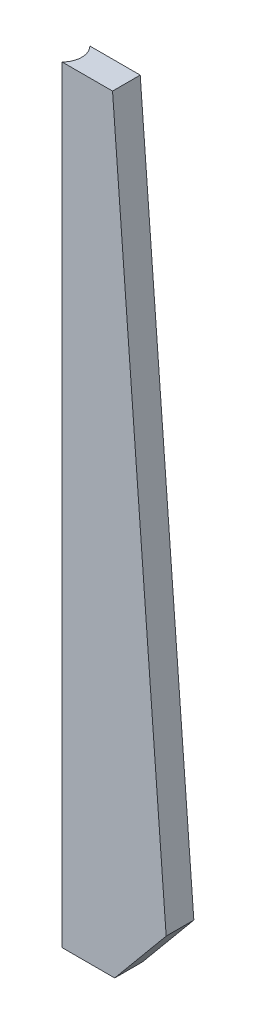
ISO-10303-21;
HEADER;
FILE_DESCRIPTION(('STEP AP214'),'2;1');
FILE_NAME('part.step','',(''),(''),'','','');
FILE_SCHEMA(('AUTOMOTIVE_DESIGN { 1 0 10303 214 1 1 1 1 }'));
ENDSEC;
DATA;
#1=APPLICATION_CONTEXT('core data for automotive mechanical design processes');
#2=APPLICATION_PROTOCOL_DEFINITION('international standard','automotive_design',2000,#1);
#3=PRODUCT_CONTEXT('',#1,'mechanical');
#4=PRODUCT('Part','Part','',(#3));
#5=PRODUCT_RELATED_PRODUCT_CATEGORY('part','',(#4));
#6=PRODUCT_DEFINITION_FORMATION('','',#4);
#7=PRODUCT_DEFINITION_CONTEXT('part definition',#1,'design');
#8=PRODUCT_DEFINITION('design','',#6,#7);
#9=PRODUCT_DEFINITION_SHAPE('','',#8);
#10=(LENGTH_UNIT() NAMED_UNIT(*) SI_UNIT(.MILLI.,.METRE.));
#11=(NAMED_UNIT(*) PLANE_ANGLE_UNIT() SI_UNIT($,.RADIAN.));
#12=(NAMED_UNIT(*) SI_UNIT($,.STERADIAN.) SOLID_ANGLE_UNIT());
#13=UNCERTAINTY_MEASURE_WITH_UNIT(LENGTH_MEASURE(1.E-05),#10,'distance_accuracy_value','');
#14=(GEOMETRIC_REPRESENTATION_CONTEXT(3) GLOBAL_UNCERTAINTY_ASSIGNED_CONTEXT((#13)) GLOBAL_UNIT_ASSIGNED_CONTEXT((#10,
#11,#12)) REPRESENTATION_CONTEXT('',''));
#15=CARTESIAN_POINT('',(0.,0.,0.));
#16=DIRECTION('',(0.,0.,1.));
#17=DIRECTION('',(1.,0.,0.));
#18=AXIS2_PLACEMENT_3D('',#15,#16,#17);
#19=CARTESIAN_POINT('',(388.602137482405,96.4501054043385,12.));
#20=DIRECTION('',(-0.76948574410608,0.638663988038713,0.));
#21=DIRECTION('',(-0.638663988038713,-0.76948574410608,0.));
#22=AXIS2_PLACEMENT_3D('',#19,#20,#21);
#23=PLANE('',#22);
#24=DIRECTION('',(0.638663988038713,0.76948574410608,0.));
#25=VECTOR('',#24,1.);
#26=CARTESIAN_POINT('',(388.602137482405,96.4501054043385,3.));
#27=LINE('',#26,#25);
#28=CARTESIAN_POINT('',(371.863564261326,76.2828598550013,3.));
#29=VERTEX_POINT('',#28);
#30=CARTESIAN_POINT('',(388.602137482405,96.4501054043385,3.));
#31=VERTEX_POINT('',#30);
#32=EDGE_CURVE('E110',#29,#31,#27,.T.);
#33=ORIENTED_EDGE('',*,*,#32,.T.);
#34=DIRECTION('',(0.,0.,-1.));
#35=VECTOR('',#34,1.);
#36=CARTESIAN_POINT('',(388.602137482405,96.4501054043385,12.));
#37=LINE('',#36,#35);
#38=CARTESIAN_POINT('',(388.602137482405,96.4501054043385,12.));
#39=VERTEX_POINT('',#38);
#40=EDGE_CURVE('E11',#39,#31,#37,.T.);
#41=ORIENTED_EDGE('',*,*,#40,.F.);
#42=DIRECTION('',(0.638663988038713,0.76948574410608,0.));
#43=VECTOR('',#42,1.);
#44=CARTESIAN_POINT('',(388.602137482405,96.4501054043385,12.));
#45=LINE('',#44,#43);
#46=CARTESIAN_POINT('',(371.863564261326,76.2828598550013,12.));
#47=VERTEX_POINT('',#46);
#48=EDGE_CURVE('E104',#47,#39,#45,.T.);
#49=ORIENTED_EDGE('',*,*,#48,.F.);
#50=DIRECTION('',(0.,0.,-1.));
#51=VECTOR('',#50,1.);
#52=CARTESIAN_POINT('',(371.863564261326,76.2828598550013,12.));
#53=LINE('',#52,#51);
#54=EDGE_CURVE('E109',#47,#29,#53,.T.);
#55=ORIENTED_EDGE('',*,*,#54,.T.);
#56=EDGE_LOOP('',(#33,#41,#49,#55));
#57=FACE_BOUND('',#56,.T.);
#58=ADVANCED_FACE('F35',(#57),#23,.F.);
#59=CARTESIAN_POINT('',(371.164187359032,325.684859855001,12.));
#60=DIRECTION('',(-0.997119153762004,-0.0758511252450758,0.));
#61=DIRECTION('',(0.0758511252450758,-0.997119153762004,0.));
#62=AXIS2_PLACEMENT_3D('',#59,#60,#61);
#63=PLANE('',#62);
#64=DIRECTION('',(-0.0758511252450758,0.997119153762004,0.));
#65=VECTOR('',#64,1.);
#66=CARTESIAN_POINT('',(371.164187359032,325.684859855001,3.));
#67=LINE('',#66,#65);
#68=CARTESIAN_POINT('',(371.164187359032,325.684859855001,3.));
#69=VERTEX_POINT('',#68);
#70=EDGE_CURVE('E113',#31,#69,#67,.T.);
#71=ORIENTED_EDGE('',*,*,#70,.T.);
#72=DIRECTION('',(0.,0.,-1.));
#73=VECTOR('',#72,1.);
#74=CARTESIAN_POINT('',(371.164187359032,325.684859855001,12.));
#75=LINE('',#74,#73);
#76=CARTESIAN_POINT('',(371.164187359032,325.684859855001,12.));
#77=VERTEX_POINT('',#76);
#78=EDGE_CURVE('E43',#77,#69,#75,.T.);
#79=ORIENTED_EDGE('',*,*,#78,.F.);
#80=DIRECTION('',(-0.0758511252450758,0.997119153762004,0.));
#81=VECTOR('',#80,1.);
#82=CARTESIAN_POINT('',(371.164187359032,325.684859855001,12.));
#83=LINE('',#82,#81);
#84=EDGE_CURVE('E81',#39,#77,#83,.T.);
#85=ORIENTED_EDGE('',*,*,#84,.F.);
#86=ORIENTED_EDGE('',*,*,#40,.T.);
#87=EDGE_LOOP('',(#71,#79,#85,#86));
#88=FACE_BOUND('',#87,.T.);
#89=ADVANCED_FACE('F127',(#88),#63,.F.);
#90=CARTESIAN_POINT('',(354.784682652771,325.684859855001,12.));
#91=DIRECTION('',(0.,-1.,0.));
#92=DIRECTION('',(0.,0.,-1.));
#93=AXIS2_PLACEMENT_3D('',#90,#91,#92);
#94=PLANE('',#93);
#95=DIRECTION('',(-1.,0.,0.));
#96=VECTOR('',#95,1.);
#97=CARTESIAN_POINT('',(354.784682652771,325.684859855001,3.));
#98=LINE('',#97,#96);
#99=CARTESIAN_POINT('',(354.784682652771,325.684859855001,3.));
#100=VERTEX_POINT('',#99);
#101=EDGE_CURVE('E99',#69,#100,#98,.T.);
#102=ORIENTED_EDGE('',*,*,#101,.T.);
#103=CARTESIAN_POINT('',(350.284682652771,325.684859855001,7.5));
#104=DIRECTION('',(0.,1.,0.));
#105=DIRECTION('',(0.,0.,1.));
#106=AXIS2_PLACEMENT_3D('',#103,#104,#105);
#107=CIRCLE('',#106,6.36396103067893);
#108=CARTESIAN_POINT('',(354.784682652771,325.684859855001,12.));
#109=VERTEX_POINT('',#108);
#110=EDGE_CURVE('E70',#109,#100,#107,.T.);
#111=ORIENTED_EDGE('',*,*,#110,.F.);
#112=DIRECTION('',(-1.,0.,0.));
#113=VECTOR('',#112,1.);
#114=CARTESIAN_POINT('',(354.784682652771,325.684859855001,12.));
#115=LINE('',#114,#113);
#116=EDGE_CURVE('E92',#77,#109,#115,.T.);
#117=ORIENTED_EDGE('',*,*,#116,.F.);
#118=ORIENTED_EDGE('',*,*,#78,.T.);
#119=EDGE_LOOP('',(#102,#111,#117,#118));
#120=FACE_BOUND('',#119,.T.);
#121=ADVANCED_FACE('F96',(#120),#94,.F.);
#122=CARTESIAN_POINT('',(354.784682652771,76.2828598550013,12.));
#123=DIRECTION('',(0.,1.,0.));
#124=DIRECTION('',(0.,0.,1.));
#125=AXIS2_PLACEMENT_3D('',#122,#123,#124);
#126=PLANE('',#125);
#127=DIRECTION('',(1.,0.,0.));
#128=VECTOR('',#127,1.);
#129=CARTESIAN_POINT('',(354.784682652771,76.2828598550013,12.));
#130=LINE('',#129,#128);
#131=CARTESIAN_POINT('',(354.784682652771,76.2828598550013,12.));
#132=VERTEX_POINT('',#131);
#133=EDGE_CURVE('E51',#132,#47,#130,.T.);
#134=ORIENTED_EDGE('',*,*,#133,.F.);
#135=CARTESIAN_POINT('',(350.284682652771,76.2828598550013,7.5));
#136=DIRECTION('',(0.,1.,0.));
#137=DIRECTION('',(0.,0.,1.));
#138=AXIS2_PLACEMENT_3D('',#135,#136,#137);
#139=CIRCLE('',#138,6.36396103067893);
#140=CARTESIAN_POINT('',(354.784682652771,76.2828598550013,3.));
#141=VERTEX_POINT('',#140);
#142=EDGE_CURVE('E90',#132,#141,#139,.T.);
#143=ORIENTED_EDGE('',*,*,#142,.T.);
#144=DIRECTION('',(1.,0.,0.));
#145=VECTOR('',#144,1.);
#146=CARTESIAN_POINT('',(354.784682652771,76.2828598550013,3.));
#147=LINE('',#146,#145);
#148=EDGE_CURVE('E76',#141,#29,#147,.T.);
#149=ORIENTED_EDGE('',*,*,#148,.T.);
#150=ORIENTED_EDGE('',*,*,#54,.F.);
#151=EDGE_LOOP('',(#134,#143,#149,#150));
#152=FACE_BOUND('',#151,.T.);
#153=ADVANCED_FACE('F122',(#152),#126,.F.);
#154=CARTESIAN_POINT('',(147.139713394103,75.5040134350218,12.));
#155=DIRECTION('',(0.,0.,1.));
#156=DIRECTION('',(1.,0.,0.));
#157=AXIS2_PLACEMENT_3D('',#154,#155,#156);
#158=PLANE('',#157);
#159=ORIENTED_EDGE('',*,*,#48,.T.);
#160=ORIENTED_EDGE('',*,*,#84,.T.);
#161=ORIENTED_EDGE('',*,*,#116,.T.);
#162=DIRECTION('',(0.,-1.,0.));
#163=VECTOR('',#162,1.);
#164=CARTESIAN_POINT('',(354.784682652771,76.2828598550013,12.));
#165=LINE('',#164,#163);
#166=EDGE_CURVE('E88',#109,#132,#165,.T.);
#167=ORIENTED_EDGE('',*,*,#166,.T.);
#168=ORIENTED_EDGE('',*,*,#133,.T.);
#169=EDGE_LOOP('',(#159,#160,#161,#167,#168));
#170=FACE_BOUND('',#169,.T.);
#171=ADVANCED_FACE('F102',(#170),#158,.T.);
#172=CARTESIAN_POINT('',(147.139713394103,75.5040134350218,3.));
#173=DIRECTION('',(0.,0.,1.));
#174=DIRECTION('',(1.,0.,0.));
#175=AXIS2_PLACEMENT_3D('',#172,#173,#174);
#176=PLANE('',#175);
#177=ORIENTED_EDGE('',*,*,#32,.F.);
#178=ORIENTED_EDGE('',*,*,#148,.F.);
#179=DIRECTION('',(0.,-1.,0.));
#180=VECTOR('',#179,1.);
#181=CARTESIAN_POINT('',(354.784682652771,76.2828598550013,3.));
#182=LINE('',#181,#180);
#183=EDGE_CURVE('E116',#100,#141,#182,.T.);
#184=ORIENTED_EDGE('',*,*,#183,.F.);
#185=ORIENTED_EDGE('',*,*,#101,.F.);
#186=ORIENTED_EDGE('',*,*,#70,.F.);
#187=EDGE_LOOP('',(#177,#178,#184,#185,#186));
#188=FACE_BOUND('',#187,.T.);
#189=ADVANCED_FACE('F121',(#188),#176,.F.);
#190=CARTESIAN_POINT('',(350.284682652771,76.2828598550013,7.5));
#191=DIRECTION('',(0.,1.,0.));
#192=DIRECTION('',(0.,0.,1.));
#193=AXIS2_PLACEMENT_3D('',#190,#191,#192);
#194=CYLINDRICAL_SURFACE('',#193,6.36396103067893);
#195=ORIENTED_EDGE('',*,*,#183,.T.);
#196=ORIENTED_EDGE('',*,*,#142,.F.);
#197=ORIENTED_EDGE('',*,*,#166,.F.);
#198=ORIENTED_EDGE('',*,*,#110,.T.);
#199=EDGE_LOOP('',(#195,#196,#197,#198));
#200=FACE_BOUND('',#199,.T.);
#201=ADVANCED_FACE('F89',(#200),#194,.F.);
#202=CLOSED_SHELL('',(#58,#89,#121,#153,#171,#189,#201));
#203=MANIFOLD_SOLID_BREP('B2',#202);
#204=ADVANCED_BREP_SHAPE_REPRESENTATION('',(#18,#203),#14);
#205=SHAPE_DEFINITION_REPRESENTATION(#9,#204);
ENDSEC;
END-ISO-10303-21;
